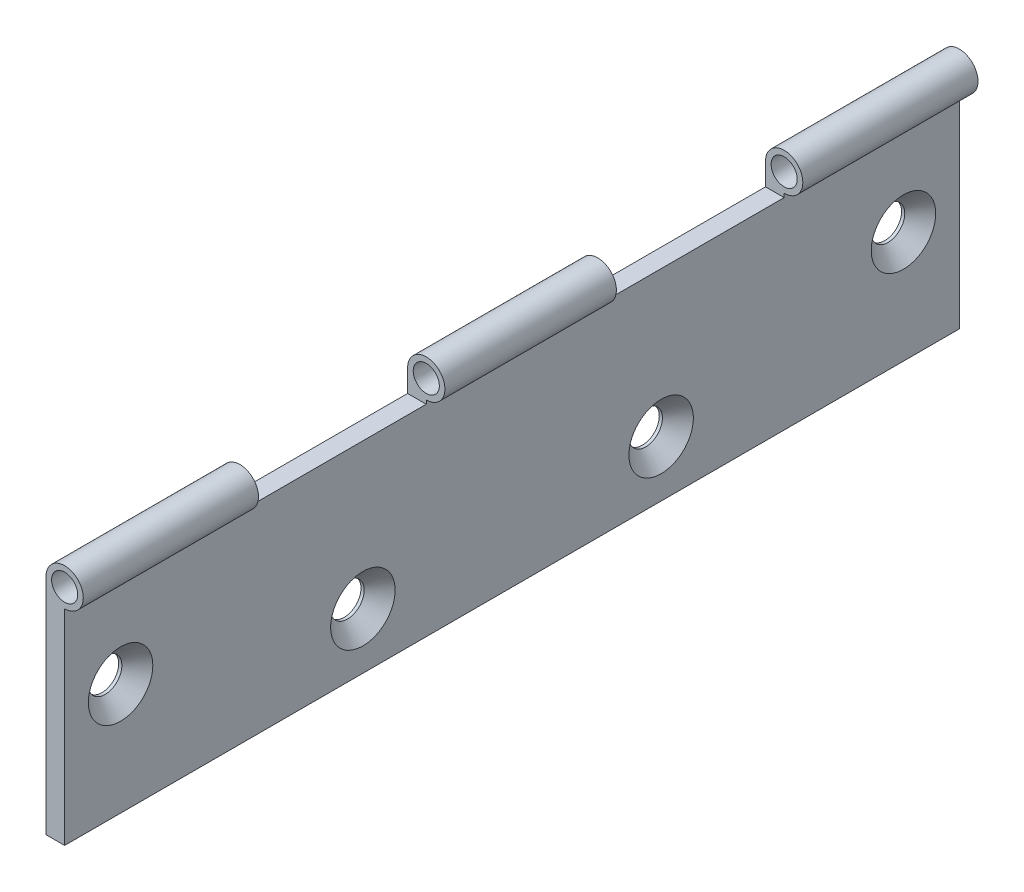
ISO-10303-21;
HEADER;
FILE_DESCRIPTION(('STEP AP214'),'2;1');
FILE_NAME('part.step','',(''),(''),'','','');
FILE_SCHEMA(('AUTOMOTIVE_DESIGN { 1 0 10303 214 1 1 1 1 }'));
ENDSEC;
DATA;
#1=APPLICATION_CONTEXT('core data for automotive mechanical design processes');
#2=APPLICATION_PROTOCOL_DEFINITION('international standard','automotive_design',2000,#1);
#3=PRODUCT_CONTEXT('',#1,'mechanical');
#4=PRODUCT('Part','Part','',(#3));
#5=PRODUCT_RELATED_PRODUCT_CATEGORY('part','',(#4));
#6=PRODUCT_DEFINITION_FORMATION('','',#4);
#7=PRODUCT_DEFINITION_CONTEXT('part definition',#1,'design');
#8=PRODUCT_DEFINITION('design','',#6,#7);
#9=PRODUCT_DEFINITION_SHAPE('','',#8);
#10=(LENGTH_UNIT() NAMED_UNIT(*) SI_UNIT(.MILLI.,.METRE.));
#11=(NAMED_UNIT(*) PLANE_ANGLE_UNIT() SI_UNIT($,.RADIAN.));
#12=(NAMED_UNIT(*) SI_UNIT($,.STERADIAN.) SOLID_ANGLE_UNIT());
#13=UNCERTAINTY_MEASURE_WITH_UNIT(LENGTH_MEASURE(1.E-05),#10,'distance_accuracy_value','');
#14=(GEOMETRIC_REPRESENTATION_CONTEXT(3) GLOBAL_UNCERTAINTY_ASSIGNED_CONTEXT((#13)) GLOBAL_UNIT_ASSIGNED_CONTEXT((#10,
#11,#12)) REPRESENTATION_CONTEXT('',''));
#15=CARTESIAN_POINT('',(0.,0.,0.));
#16=DIRECTION('',(0.,0.,1.));
#17=DIRECTION('',(1.,0.,0.));
#18=AXIS2_PLACEMENT_3D('',#15,#16,#17);
#19=CARTESIAN_POINT('',(5.,60.,-120.));
#20=DIRECTION('',(0.,0.,1.));
#21=DIRECTION('',(1.,0.,0.));
#22=AXIS2_PLACEMENT_3D('',#19,#20,#21);
#23=CYLINDRICAL_SURFACE('',#22,5.);
#24=CARTESIAN_POINT('',(5.,60.,-23.));
#25=DIRECTION('',(0.,0.,1.));
#26=DIRECTION('',(0.,-1.,0.));
#27=AXIS2_PLACEMENT_3D('',#24,#25,#26);
#28=CIRCLE('',#27,5.);
#29=CARTESIAN_POINT('',(0.,60.,-23.));
#30=VERTEX_POINT('',#29);
#31=CARTESIAN_POINT('',(5.,55.,-23.));
#32=VERTEX_POINT('',#31);
#33=EDGE_CURVE('E264',#30,#32,#28,.F.);
#34=ORIENTED_EDGE('',*,*,#33,.F.);
#35=DIRECTION('',(0.,0.,-1.));
#36=VECTOR('',#35,1.);
#37=CARTESIAN_POINT('',(0.,60.,120.));
#38=LINE('',#37,#36);
#39=CARTESIAN_POINT('',(0.,60.,23.));
#40=VERTEX_POINT('',#39);
#41=EDGE_CURVE('E105',#40,#30,#38,.T.);
#42=ORIENTED_EDGE('',*,*,#41,.F.);
#43=CARTESIAN_POINT('',(5.,60.,23.));
#44=DIRECTION('',(0.,0.,-1.));
#45=DIRECTION('',(-1.,0.,0.));
#46=AXIS2_PLACEMENT_3D('',#43,#44,#45);
#47=CIRCLE('',#46,5.);
#48=CARTESIAN_POINT('',(5.,55.,23.));
#49=VERTEX_POINT('',#48);
#50=EDGE_CURVE('E112',#49,#40,#47,.F.);
#51=ORIENTED_EDGE('',*,*,#50,.F.);
#52=DIRECTION('',(0.,0.,1.));
#53=VECTOR('',#52,1.);
#54=CARTESIAN_POINT('',(5.,55.,-120.));
#55=LINE('',#54,#53);
#56=EDGE_CURVE('E180',#32,#49,#55,.T.);
#57=ORIENTED_EDGE('',*,*,#56,.F.);
#58=EDGE_LOOP('',(#34,#42,#51,#57));
#59=FACE_BOUND('',#58,.T.);
#60=ADVANCED_FACE('F33',(#59),#23,.T.);
#61=CARTESIAN_POINT('',(5.,60.,-120.));
#62=DIRECTION('',(0.,0.,1.));
#63=DIRECTION('',(1.,0.,0.));
#64=AXIS2_PLACEMENT_3D('',#61,#62,#63);
#65=CYLINDRICAL_SURFACE('',#64,3.5);
#66=CARTESIAN_POINT('',(5.,60.,-73.));
#67=DIRECTION('',(0.,0.,-1.));
#68=DIRECTION('',(0.,1.,0.));
#69=AXIS2_PLACEMENT_3D('',#66,#67,#68);
#70=CIRCLE('',#69,3.5);
#71=CARTESIAN_POINT('',(5.,63.5,-73.));
#72=VERTEX_POINT('',#71);
#73=EDGE_CURVE('E273',#72,#72,#70,.F.);
#74=ORIENTED_EDGE('',*,*,#73,.T.);
#75=EDGE_LOOP('',(#74));
#76=FACE_BOUND('',#75,.T.);
#77=CARTESIAN_POINT('',(5.,60.,-120.));
#78=DIRECTION('',(0.,0.,1.));
#79=DIRECTION('',(1.,0.,0.));
#80=AXIS2_PLACEMENT_3D('',#77,#78,#79);
#81=CIRCLE('',#80,3.5);
#82=CARTESIAN_POINT('',(8.5,60.,-120.));
#83=VERTEX_POINT('',#82);
#84=EDGE_CURVE('E170',#83,#83,#81,.T.);
#85=ORIENTED_EDGE('',*,*,#84,.F.);
#86=EDGE_LOOP('',(#85));
#87=FACE_BOUND('',#86,.T.);
#88=ADVANCED_FACE('F311',(#76,#87),#65,.F.);
#89=CARTESIAN_POINT('',(5.,60.,-73.));
#90=DIRECTION('',(0.,0.,-1.));
#91=DIRECTION('',(0.,1.,0.));
#92=AXIS2_PLACEMENT_3D('',#89,#90,#91);
#93=CIRCLE('',#92,5.);
#94=CARTESIAN_POINT('',(5.,55.,-73.));
#95=VERTEX_POINT('',#94);
#96=CARTESIAN_POINT('',(0.,60.,-73.));
#97=VERTEX_POINT('',#96);
#98=EDGE_CURVE('E254',#95,#97,#93,.F.);
#99=ORIENTED_EDGE('',*,*,#98,.F.);
#100=CARTESIAN_POINT('',(5.,55.,-120.));
#101=VERTEX_POINT('',#100);
#102=EDGE_CURVE('E92',#101,#95,#55,.T.);
#103=ORIENTED_EDGE('',*,*,#102,.F.);
#104=CARTESIAN_POINT('',(5.,60.,-120.));
#105=DIRECTION('',(0.,0.,1.));
#106=DIRECTION('',(1.,0.,0.));
#107=AXIS2_PLACEMENT_3D('',#104,#105,#106);
#108=CIRCLE('',#107,5.);
#109=CARTESIAN_POINT('',(0.,60.,-120.));
#110=VERTEX_POINT('',#109);
#111=EDGE_CURVE('E90',#101,#110,#108,.T.);
#112=ORIENTED_EDGE('',*,*,#111,.T.);
#113=EDGE_CURVE('E102',#97,#110,#38,.T.);
#114=ORIENTED_EDGE('',*,*,#113,.F.);
#115=EDGE_LOOP('',(#99,#103,#112,#114));
#116=FACE_BOUND('',#115,.T.);
#117=ADVANCED_FACE('F303',(#116),#23,.T.);
#118=CARTESIAN_POINT('',(5.,60.,-23.));
#119=DIRECTION('',(0.,0.,1.));
#120=DIRECTION('',(0.,-1.,0.));
#121=AXIS2_PLACEMENT_3D('',#118,#119,#120);
#122=CIRCLE('',#121,3.5);
#123=CARTESIAN_POINT('',(5.,56.5,-23.));
#124=VERTEX_POINT('',#123);
#125=EDGE_CURVE('E266',#124,#124,#122,.F.);
#126=ORIENTED_EDGE('',*,*,#125,.T.);
#127=EDGE_LOOP('',(#126));
#128=FACE_BOUND('',#127,.T.);
#129=CARTESIAN_POINT('',(5.,60.,23.));
#130=DIRECTION('',(0.,0.,-1.));
#131=DIRECTION('',(-1.,0.,0.));
#132=AXIS2_PLACEMENT_3D('',#129,#130,#131);
#133=CIRCLE('',#132,3.5);
#134=CARTESIAN_POINT('',(1.5,60.,23.));
#135=VERTEX_POINT('',#134);
#136=EDGE_CURVE('E110',#135,#135,#133,.F.);
#137=ORIENTED_EDGE('',*,*,#136,.T.);
#138=EDGE_LOOP('',(#137));
#139=FACE_BOUND('',#138,.T.);
#140=ADVANCED_FACE('F312',(#128,#139),#65,.F.);
#141=CARTESIAN_POINT('',(5.,0.,120.));
#142=DIRECTION('',(-1.,0.,0.));
#143=DIRECTION('',(0.,0.,1.));
#144=AXIS2_PLACEMENT_3D('',#141,#142,#143);
#145=PLANE('',#144);
#146=CARTESIAN_POINT('',(5.,30.,-105.));
#147=DIRECTION('',(1.,0.,0.));
#148=DIRECTION('',(0.,0.,-1.));
#149=AXIS2_PLACEMENT_3D('',#146,#147,#148);
#150=CIRCLE('',#149,8.65);
#151=CARTESIAN_POINT('',(5.,30.,-113.65));
#152=VERTEX_POINT('',#151);
#153=EDGE_CURVE('E133',#152,#152,#150,.T.);
#154=ORIENTED_EDGE('',*,*,#153,.F.);
#155=EDGE_LOOP('',(#154));
#156=FACE_BOUND('',#155,.T.);
#157=CARTESIAN_POINT('',(5.,15.,-40.));
#158=DIRECTION('',(1.,0.,0.));
#159=DIRECTION('',(0.,0.,-1.));
#160=AXIS2_PLACEMENT_3D('',#157,#158,#159);
#161=CIRCLE('',#160,8.65);
#162=CARTESIAN_POINT('',(5.,15.,-48.65));
#163=VERTEX_POINT('',#162);
#164=EDGE_CURVE('E142',#163,#163,#161,.T.);
#165=ORIENTED_EDGE('',*,*,#164,.F.);
#166=EDGE_LOOP('',(#165));
#167=FACE_BOUND('',#166,.T.);
#168=CARTESIAN_POINT('',(5.,30.,105.));
#169=DIRECTION('',(1.,0.,0.));
#170=DIRECTION('',(0.,0.,-1.));
#171=AXIS2_PLACEMENT_3D('',#168,#169,#170);
#172=CIRCLE('',#171,8.65);
#173=CARTESIAN_POINT('',(5.,30.,96.35));
#174=VERTEX_POINT('',#173);
#175=EDGE_CURVE('E151',#174,#174,#172,.T.);
#176=ORIENTED_EDGE('',*,*,#175,.F.);
#177=EDGE_LOOP('',(#176));
#178=FACE_BOUND('',#177,.T.);
#179=CARTESIAN_POINT('',(5.,15.,40.));
#180=DIRECTION('',(1.,0.,0.));
#181=DIRECTION('',(0.,0.,-1.));
#182=AXIS2_PLACEMENT_3D('',#179,#180,#181);
#183=CIRCLE('',#182,8.65);
#184=CARTESIAN_POINT('',(5.,15.,31.35));
#185=VERTEX_POINT('',#184);
#186=EDGE_CURVE('E160',#185,#185,#183,.T.);
#187=ORIENTED_EDGE('',*,*,#186,.F.);
#188=EDGE_LOOP('',(#187));
#189=FACE_BOUND('',#188,.T.);
#190=ORIENTED_EDGE('',*,*,#102,.T.);
#191=DIRECTION('',(0.,-1.,0.));
#192=VECTOR('',#191,1.);
#193=CARTESIAN_POINT('',(5.,2.43492095173471E-13,-73.0000000000001));
#194=LINE('',#193,#192);
#195=CARTESIAN_POINT('',(5.,54.,-73.));
#196=VERTEX_POINT('',#195);
#197=EDGE_CURVE('E270',#95,#196,#194,.T.);
#198=ORIENTED_EDGE('',*,*,#197,.T.);
#199=DIRECTION('',(0.,0.,1.));
#200=VECTOR('',#199,1.);
#201=CARTESIAN_POINT('',(5.,54.,120.));
#202=LINE('',#201,#200);
#203=CARTESIAN_POINT('',(5.,54.,-23.));
#204=VERTEX_POINT('',#203);
#205=EDGE_CURVE('E244',#196,#204,#202,.T.);
#206=ORIENTED_EDGE('',*,*,#205,.T.);
#207=DIRECTION('',(0.,1.,0.));
#208=VECTOR('',#207,1.);
#209=CARTESIAN_POINT('',(5.,0.,-23.));
#210=LINE('',#209,#208);
#211=EDGE_CURVE('E248',#204,#32,#210,.T.);
#212=ORIENTED_EDGE('',*,*,#211,.T.);
#213=ORIENTED_EDGE('',*,*,#56,.T.);
#214=DIRECTION('',(0.,-1.,0.));
#215=VECTOR('',#214,1.);
#216=CARTESIAN_POINT('',(5.,0.,23.));
#217=LINE('',#216,#215);
#218=CARTESIAN_POINT('',(5.,54.,23.));
#219=VERTEX_POINT('',#218);
#220=EDGE_CURVE('E117',#49,#219,#217,.T.);
#221=ORIENTED_EDGE('',*,*,#220,.T.);
#222=DIRECTION('',(0.,0.,1.));
#223=VECTOR('',#222,1.);
#224=CARTESIAN_POINT('',(5.,54.,120.));
#225=LINE('',#224,#223);
#226=CARTESIAN_POINT('',(5.,54.,73.));
#227=VERTEX_POINT('',#226);
#228=EDGE_CURVE('E131',#219,#227,#225,.T.);
#229=ORIENTED_EDGE('',*,*,#228,.T.);
#230=DIRECTION('',(0.,1.,0.));
#231=VECTOR('',#230,1.);
#232=CARTESIAN_POINT('',(5.,0.,73.0000000000001));
#233=LINE('',#232,#231);
#234=CARTESIAN_POINT('',(5.,55.,73.));
#235=VERTEX_POINT('',#234);
#236=EDGE_CURVE('E113',#227,#235,#233,.T.);
#237=ORIENTED_EDGE('',*,*,#236,.T.);
#238=CARTESIAN_POINT('',(5.,55.,120.));
#239=VERTEX_POINT('',#238);
#240=EDGE_CURVE('E177',#235,#239,#55,.T.);
#241=ORIENTED_EDGE('',*,*,#240,.T.);
#242=DIRECTION('',(0.,1.,0.));
#243=VECTOR('',#242,1.);
#244=CARTESIAN_POINT('',(5.,0.,120.));
#245=LINE('',#244,#243);
#246=CARTESIAN_POINT('',(5.,0.,120.));
#247=VERTEX_POINT('',#246);
#248=EDGE_CURVE('E78',#247,#239,#245,.T.);
#249=ORIENTED_EDGE('',*,*,#248,.F.);
#250=DIRECTION('',(0.,0.,-1.));
#251=VECTOR('',#250,1.);
#252=CARTESIAN_POINT('',(5.,0.,120.));
#253=LINE('',#252,#251);
#254=CARTESIAN_POINT('',(5.,0.,-120.));
#255=VERTEX_POINT('',#254);
#256=EDGE_CURVE('E57',#247,#255,#253,.T.);
#257=ORIENTED_EDGE('',*,*,#256,.T.);
#258=DIRECTION('',(0.,1.,0.));
#259=VECTOR('',#258,1.);
#260=CARTESIAN_POINT('',(5.,0.,-120.));
#261=LINE('',#260,#259);
#262=EDGE_CURVE('E75',#255,#101,#261,.T.);
#263=ORIENTED_EDGE('',*,*,#262,.T.);
#264=EDGE_LOOP('',(#190,#198,#206,#212,#213,#221,#229,#237,#241,#249,#257,#263));
#265=FACE_BOUND('',#264,.T.);
#266=ADVANCED_FACE('F35',(#156,#167,#178,#189,#265),#145,.F.);
#267=CARTESIAN_POINT('',(0.,0.,120.));
#268=DIRECTION('',(-1.,0.,0.));
#269=DIRECTION('',(0.,0.,1.));
#270=AXIS2_PLACEMENT_3D('',#267,#268,#269);
#271=PLANE('',#270);
#272=DIRECTION('',(0.,1.,0.));
#273=VECTOR('',#272,1.);
#274=CARTESIAN_POINT('',(0.,65.,-73.));
#275=LINE('',#274,#273);
#276=CARTESIAN_POINT('',(0.,54.,-73.));
#277=VERTEX_POINT('',#276);
#278=EDGE_CURVE('E251',#277,#97,#275,.T.);
#279=ORIENTED_EDGE('',*,*,#278,.T.);
#280=ORIENTED_EDGE('',*,*,#113,.T.);
#281=DIRECTION('',(0.,1.,0.));
#282=VECTOR('',#281,1.);
#283=CARTESIAN_POINT('',(0.,0.,-120.));
#284=LINE('',#283,#282);
#285=CARTESIAN_POINT('',(0.,0.,-120.));
#286=VERTEX_POINT('',#285);
#287=EDGE_CURVE('E91',#286,#110,#284,.T.);
#288=ORIENTED_EDGE('',*,*,#287,.F.);
#289=DIRECTION('',(0.,0.,-1.));
#290=VECTOR('',#289,1.);
#291=CARTESIAN_POINT('',(0.,0.,120.));
#292=LINE('',#291,#290);
#293=CARTESIAN_POINT('',(0.,0.,120.));
#294=VERTEX_POINT('',#293);
#295=EDGE_CURVE('E80',#294,#286,#292,.T.);
#296=ORIENTED_EDGE('',*,*,#295,.F.);
#297=DIRECTION('',(0.,1.,0.));
#298=VECTOR('',#297,1.);
#299=CARTESIAN_POINT('',(0.,0.,120.));
#300=LINE('',#299,#298);
#301=CARTESIAN_POINT('',(0.,60.,120.));
#302=VERTEX_POINT('',#301);
#303=EDGE_CURVE('E97',#294,#302,#300,.T.);
#304=ORIENTED_EDGE('',*,*,#303,.T.);
#305=CARTESIAN_POINT('',(0.,60.,73.));
#306=VERTEX_POINT('',#305);
#307=EDGE_CURVE('E41',#302,#306,#38,.T.);
#308=ORIENTED_EDGE('',*,*,#307,.T.);
#309=DIRECTION('',(0.,-1.,0.));
#310=VECTOR('',#309,1.);
#311=CARTESIAN_POINT('',(0.,65.,73.));
#312=LINE('',#311,#310);
#313=CARTESIAN_POINT('',(0.,54.,73.));
#314=VERTEX_POINT('',#313);
#315=EDGE_CURVE('E276',#306,#314,#312,.T.);
#316=ORIENTED_EDGE('',*,*,#315,.T.);
#317=DIRECTION('',(0.,0.,-1.));
#318=VECTOR('',#317,1.);
#319=CARTESIAN_POINT('',(0.,54.,23.));
#320=LINE('',#319,#318);
#321=CARTESIAN_POINT('',(0.,54.,23.));
#322=VERTEX_POINT('',#321);
#323=EDGE_CURVE('E278',#314,#322,#320,.T.);
#324=ORIENTED_EDGE('',*,*,#323,.T.);
#325=DIRECTION('',(0.,1.,0.));
#326=VECTOR('',#325,1.);
#327=CARTESIAN_POINT('',(0.,65.,23.));
#328=LINE('',#327,#326);
#329=EDGE_CURVE('E281',#322,#40,#328,.T.);
#330=ORIENTED_EDGE('',*,*,#329,.T.);
#331=ORIENTED_EDGE('',*,*,#41,.T.);
#332=DIRECTION('',(0.,1.,0.));
#333=VECTOR('',#332,1.);
#334=CARTESIAN_POINT('',(0.,0.,-23.));
#335=LINE('',#334,#333);
#336=CARTESIAN_POINT('',(0.,54.,-23.));
#337=VERTEX_POINT('',#336);
#338=EDGE_CURVE('E11',#337,#30,#335,.T.);
#339=ORIENTED_EDGE('',*,*,#338,.F.);
#340=DIRECTION('',(0.,0.,-1.));
#341=VECTOR('',#340,1.);
#342=CARTESIAN_POINT('',(0.,54.,-73.));
#343=LINE('',#342,#341);
#344=EDGE_CURVE('E48',#337,#277,#343,.T.);
#345=ORIENTED_EDGE('',*,*,#344,.T.);
#346=EDGE_LOOP('',(#279,#280,#288,#296,#304,#308,#316,#324,#330,#331,#339,#345));
#347=FACE_BOUND('',#346,.T.);
#348=CARTESIAN_POINT('',(0.,30.,-105.));
#349=DIRECTION('',(1.,0.,0.));
#350=DIRECTION('',(0.,0.,-1.));
#351=AXIS2_PLACEMENT_3D('',#348,#349,#350);
#352=CIRCLE('',#351,4.5);
#353=CARTESIAN_POINT('',(0.,30.,-109.5));
#354=VERTEX_POINT('',#353);
#355=EDGE_CURVE('E139',#354,#354,#352,.T.);
#356=ORIENTED_EDGE('',*,*,#355,.T.);
#357=EDGE_LOOP('',(#356));
#358=FACE_BOUND('',#357,.T.);
#359=CARTESIAN_POINT('',(0.,15.,-40.));
#360=DIRECTION('',(1.,0.,0.));
#361=DIRECTION('',(0.,0.,-1.));
#362=AXIS2_PLACEMENT_3D('',#359,#360,#361);
#363=CIRCLE('',#362,4.5);
#364=CARTESIAN_POINT('',(0.,15.,-44.5));
#365=VERTEX_POINT('',#364);
#366=EDGE_CURVE('E148',#365,#365,#363,.T.);
#367=ORIENTED_EDGE('',*,*,#366,.T.);
#368=EDGE_LOOP('',(#367));
#369=FACE_BOUND('',#368,.T.);
#370=CARTESIAN_POINT('',(0.,30.,105.));
#371=DIRECTION('',(1.,0.,0.));
#372=DIRECTION('',(0.,0.,-1.));
#373=AXIS2_PLACEMENT_3D('',#370,#371,#372);
#374=CIRCLE('',#373,4.5);
#375=CARTESIAN_POINT('',(0.,30.,100.5));
#376=VERTEX_POINT('',#375);
#377=EDGE_CURVE('E157',#376,#376,#374,.T.);
#378=ORIENTED_EDGE('',*,*,#377,.T.);
#379=EDGE_LOOP('',(#378));
#380=FACE_BOUND('',#379,.T.);
#381=CARTESIAN_POINT('',(0.,15.,40.));
#382=DIRECTION('',(1.,0.,0.));
#383=DIRECTION('',(0.,0.,-1.));
#384=AXIS2_PLACEMENT_3D('',#381,#382,#383);
#385=CIRCLE('',#384,4.5);
#386=CARTESIAN_POINT('',(0.,15.,35.5));
#387=VERTEX_POINT('',#386);
#388=EDGE_CURVE('E166',#387,#387,#385,.T.);
#389=ORIENTED_EDGE('',*,*,#388,.T.);
#390=EDGE_LOOP('',(#389));
#391=FACE_BOUND('',#390,.T.);
#392=ADVANCED_FACE('F191',(#347,#358,#369,#380,#391),#271,.T.);
#393=CARTESIAN_POINT('',(5.,0.,120.));
#394=DIRECTION('',(0.,-1.,0.));
#395=DIRECTION('',(0.,0.,-1.));
#396=AXIS2_PLACEMENT_3D('',#393,#394,#395);
#397=PLANE('',#396);
#398=DIRECTION('',(-1.,0.,0.));
#399=VECTOR('',#398,1.);
#400=CARTESIAN_POINT('',(5.,0.,-120.));
#401=LINE('',#400,#399);
#402=EDGE_CURVE('E88',#255,#286,#401,.T.);
#403=ORIENTED_EDGE('',*,*,#402,.F.);
#404=ORIENTED_EDGE('',*,*,#256,.F.);
#405=DIRECTION('',(-1.,0.,0.));
#406=VECTOR('',#405,1.);
#407=CARTESIAN_POINT('',(5.,0.,120.));
#408=LINE('',#407,#406);
#409=EDGE_CURVE('E81',#247,#294,#408,.T.);
#410=ORIENTED_EDGE('',*,*,#409,.T.);
#411=ORIENTED_EDGE('',*,*,#295,.T.);
#412=EDGE_LOOP('',(#403,#404,#410,#411));
#413=FACE_BOUND('',#412,.T.);
#414=ADVANCED_FACE('F94',(#413),#397,.T.);
#415=CARTESIAN_POINT('',(0.,0.,120.));
#416=DIRECTION('',(0.,0.,-1.));
#417=DIRECTION('',(-1.,0.,0.));
#418=AXIS2_PLACEMENT_3D('',#415,#416,#417);
#419=PLANE('',#418);
#420=CARTESIAN_POINT('',(5.,60.,120.));
#421=DIRECTION('',(0.,0.,1.));
#422=DIRECTION('',(1.,0.,0.));
#423=AXIS2_PLACEMENT_3D('',#420,#421,#422);
#424=CIRCLE('',#423,3.5);
#425=CARTESIAN_POINT('',(8.5,60.,120.));
#426=VERTEX_POINT('',#425);
#427=EDGE_CURVE('E169',#426,#426,#424,.T.);
#428=ORIENTED_EDGE('',*,*,#427,.F.);
#429=EDGE_LOOP('',(#428));
#430=FACE_BOUND('',#429,.T.);
#431=ORIENTED_EDGE('',*,*,#248,.T.);
#432=CARTESIAN_POINT('',(5.,60.,120.));
#433=DIRECTION('',(0.,0.,1.));
#434=DIRECTION('',(1.,0.,0.));
#435=AXIS2_PLACEMENT_3D('',#432,#433,#434);
#436=CIRCLE('',#435,5.);
#437=EDGE_CURVE('E173',#239,#302,#436,.T.);
#438=ORIENTED_EDGE('',*,*,#437,.T.);
#439=ORIENTED_EDGE('',*,*,#303,.F.);
#440=ORIENTED_EDGE('',*,*,#409,.F.);
#441=EDGE_LOOP('',(#431,#438,#439,#440));
#442=FACE_BOUND('',#441,.T.);
#443=ADVANCED_FACE('F186',(#430,#442),#419,.F.);
#444=CARTESIAN_POINT('',(0.,0.,-120.));
#445=DIRECTION('',(0.,0.,-1.));
#446=DIRECTION('',(-1.,0.,0.));
#447=AXIS2_PLACEMENT_3D('',#444,#445,#446);
#448=PLANE('',#447);
#449=ORIENTED_EDGE('',*,*,#84,.T.);
#450=EDGE_LOOP('',(#449));
#451=FACE_BOUND('',#450,.T.);
#452=ORIENTED_EDGE('',*,*,#287,.T.);
#453=ORIENTED_EDGE('',*,*,#111,.F.);
#454=ORIENTED_EDGE('',*,*,#262,.F.);
#455=ORIENTED_EDGE('',*,*,#402,.T.);
#456=EDGE_LOOP('',(#452,#453,#454,#455));
#457=FACE_BOUND('',#456,.T.);
#458=ADVANCED_FACE('F87',(#451,#457),#448,.T.);
#459=CARTESIAN_POINT('',(5.,60.,73.));
#460=DIRECTION('',(0.,0.,1.));
#461=DIRECTION('',(0.,-1.,0.));
#462=AXIS2_PLACEMENT_3D('',#459,#460,#461);
#463=CIRCLE('',#462,5.);
#464=EDGE_CURVE('E108',#306,#235,#463,.F.);
#465=ORIENTED_EDGE('',*,*,#464,.F.);
#466=ORIENTED_EDGE('',*,*,#307,.F.);
#467=ORIENTED_EDGE('',*,*,#437,.F.);
#468=ORIENTED_EDGE('',*,*,#240,.F.);
#469=EDGE_LOOP('',(#465,#466,#467,#468));
#470=FACE_BOUND('',#469,.T.);
#471=ADVANCED_FACE('F299',(#470),#23,.T.);
#472=CARTESIAN_POINT('',(5.,60.,73.));
#473=DIRECTION('',(0.,0.,1.));
#474=DIRECTION('',(0.,-1.,0.));
#475=AXIS2_PLACEMENT_3D('',#472,#473,#474);
#476=CIRCLE('',#475,3.5);
#477=CARTESIAN_POINT('',(5.,56.5,73.));
#478=VERTEX_POINT('',#477);
#479=EDGE_CURVE('E106',#478,#478,#476,.F.);
#480=ORIENTED_EDGE('',*,*,#479,.T.);
#481=EDGE_LOOP('',(#480));
#482=FACE_BOUND('',#481,.T.);
#483=ORIENTED_EDGE('',*,*,#427,.T.);
#484=EDGE_LOOP('',(#483));
#485=FACE_BOUND('',#484,.T.);
#486=ADVANCED_FACE('F301',(#482,#485),#65,.F.);
#487=CARTESIAN_POINT('',(5.,15.,40.));
#488=DIRECTION('',(1.,0.,0.));
#489=DIRECTION('',(0.,0.,-1.));
#490=AXIS2_PLACEMENT_3D('',#487,#488,#489);
#491=CYLINDRICAL_SURFACE('',#490,4.5);
#492=ORIENTED_EDGE('',*,*,#388,.F.);
#493=EDGE_LOOP('',(#492));
#494=FACE_BOUND('',#493,.T.);
#495=CARTESIAN_POINT('',(0.850000000000003,15.,40.));
#496=DIRECTION('',(1.,0.,0.));
#497=DIRECTION('',(0.,0.,-1.));
#498=AXIS2_PLACEMENT_3D('',#495,#496,#497);
#499=CIRCLE('',#498,4.5);
#500=CARTESIAN_POINT('',(0.850000000000003,15.,35.5));
#501=VERTEX_POINT('',#500);
#502=EDGE_CURVE('E163',#501,#501,#499,.T.);
#503=ORIENTED_EDGE('',*,*,#502,.T.);
#504=EDGE_LOOP('',(#503));
#505=FACE_BOUND('',#504,.T.);
#506=ADVANCED_FACE('F308',(#494,#505),#491,.F.);
#507=CARTESIAN_POINT('',(5.,15.,40.));
#508=DIRECTION('',(1.,0.,0.));
#509=DIRECTION('',(0.,0.,-1.));
#510=AXIS2_PLACEMENT_3D('',#507,#508,#509);
#511=CONICAL_SURFACE('',#510,8.65,0.785398163397448);
#512=ORIENTED_EDGE('',*,*,#502,.F.);
#513=EDGE_LOOP('',(#512));
#514=FACE_BOUND('',#513,.T.);
#515=ORIENTED_EDGE('',*,*,#186,.T.);
#516=EDGE_LOOP('',(#515));
#517=FACE_BOUND('',#516,.T.);
#518=ADVANCED_FACE('F371',(#514,#517),#511,.F.);
#519=CARTESIAN_POINT('',(5.,30.,105.));
#520=DIRECTION('',(1.,0.,0.));
#521=DIRECTION('',(0.,0.,-1.));
#522=AXIS2_PLACEMENT_3D('',#519,#520,#521);
#523=CYLINDRICAL_SURFACE('',#522,4.5);
#524=ORIENTED_EDGE('',*,*,#377,.F.);
#525=EDGE_LOOP('',(#524));
#526=FACE_BOUND('',#525,.T.);
#527=CARTESIAN_POINT('',(0.850000000000003,30.,105.));
#528=DIRECTION('',(1.,0.,0.));
#529=DIRECTION('',(0.,0.,-1.));
#530=AXIS2_PLACEMENT_3D('',#527,#528,#529);
#531=CIRCLE('',#530,4.5);
#532=CARTESIAN_POINT('',(0.850000000000003,30.,100.5));
#533=VERTEX_POINT('',#532);
#534=EDGE_CURVE('E154',#533,#533,#531,.T.);
#535=ORIENTED_EDGE('',*,*,#534,.T.);
#536=EDGE_LOOP('',(#535));
#537=FACE_BOUND('',#536,.T.);
#538=ADVANCED_FACE('F367',(#526,#537),#523,.F.);
#539=CARTESIAN_POINT('',(5.,30.,105.));
#540=DIRECTION('',(1.,0.,0.));
#541=DIRECTION('',(0.,0.,-1.));
#542=AXIS2_PLACEMENT_3D('',#539,#540,#541);
#543=CONICAL_SURFACE('',#542,8.65,0.785398163397449);
#544=ORIENTED_EDGE('',*,*,#534,.F.);
#545=EDGE_LOOP('',(#544));
#546=FACE_BOUND('',#545,.T.);
#547=ORIENTED_EDGE('',*,*,#175,.T.);
#548=EDGE_LOOP('',(#547));
#549=FACE_BOUND('',#548,.T.);
#550=ADVANCED_FACE('F363',(#546,#549),#543,.F.);
#551=CARTESIAN_POINT('',(5.,15.,-40.));
#552=DIRECTION('',(1.,0.,0.));
#553=DIRECTION('',(0.,0.,-1.));
#554=AXIS2_PLACEMENT_3D('',#551,#552,#553);
#555=CYLINDRICAL_SURFACE('',#554,4.5);
#556=ORIENTED_EDGE('',*,*,#366,.F.);
#557=EDGE_LOOP('',(#556));
#558=FACE_BOUND('',#557,.T.);
#559=CARTESIAN_POINT('',(0.850000000000003,15.,-40.));
#560=DIRECTION('',(1.,0.,0.));
#561=DIRECTION('',(0.,0.,-1.));
#562=AXIS2_PLACEMENT_3D('',#559,#560,#561);
#563=CIRCLE('',#562,4.5);
#564=CARTESIAN_POINT('',(0.850000000000003,15.,-44.5));
#565=VERTEX_POINT('',#564);
#566=EDGE_CURVE('E145',#565,#565,#563,.T.);
#567=ORIENTED_EDGE('',*,*,#566,.T.);
#568=EDGE_LOOP('',(#567));
#569=FACE_BOUND('',#568,.T.);
#570=ADVANCED_FACE('F359',(#558,#569),#555,.F.);
#571=CARTESIAN_POINT('',(5.,15.,-40.));
#572=DIRECTION('',(1.,0.,0.));
#573=DIRECTION('',(0.,0.,-1.));
#574=AXIS2_PLACEMENT_3D('',#571,#572,#573);
#575=CONICAL_SURFACE('',#574,8.65,0.785398163397448);
#576=ORIENTED_EDGE('',*,*,#566,.F.);
#577=EDGE_LOOP('',(#576));
#578=FACE_BOUND('',#577,.T.);
#579=ORIENTED_EDGE('',*,*,#164,.T.);
#580=EDGE_LOOP('',(#579));
#581=FACE_BOUND('',#580,.T.);
#582=ADVANCED_FACE('F355',(#578,#581),#575,.F.);
#583=CARTESIAN_POINT('',(5.,30.,-105.));
#584=DIRECTION('',(1.,0.,0.));
#585=DIRECTION('',(0.,0.,-1.));
#586=AXIS2_PLACEMENT_3D('',#583,#584,#585);
#587=CYLINDRICAL_SURFACE('',#586,4.5);
#588=ORIENTED_EDGE('',*,*,#355,.F.);
#589=EDGE_LOOP('',(#588));
#590=FACE_BOUND('',#589,.T.);
#591=CARTESIAN_POINT('',(0.850000000000003,30.,-105.));
#592=DIRECTION('',(1.,0.,0.));
#593=DIRECTION('',(0.,0.,-1.));
#594=AXIS2_PLACEMENT_3D('',#591,#592,#593);
#595=CIRCLE('',#594,4.5);
#596=CARTESIAN_POINT('',(0.850000000000003,30.,-109.5));
#597=VERTEX_POINT('',#596);
#598=EDGE_CURVE('E136',#597,#597,#595,.T.);
#599=ORIENTED_EDGE('',*,*,#598,.T.);
#600=EDGE_LOOP('',(#599));
#601=FACE_BOUND('',#600,.T.);
#602=ADVANCED_FACE('F351',(#590,#601),#587,.F.);
#603=CARTESIAN_POINT('',(5.,30.,-105.));
#604=DIRECTION('',(1.,0.,0.));
#605=DIRECTION('',(0.,0.,-1.));
#606=AXIS2_PLACEMENT_3D('',#603,#604,#605);
#607=CONICAL_SURFACE('',#606,8.65,0.785398163397449);
#608=ORIENTED_EDGE('',*,*,#598,.F.);
#609=EDGE_LOOP('',(#608));
#610=FACE_BOUND('',#609,.T.);
#611=ORIENTED_EDGE('',*,*,#153,.T.);
#612=EDGE_LOOP('',(#611));
#613=FACE_BOUND('',#612,.T.);
#614=ADVANCED_FACE('F345',(#610,#613),#607,.F.);
#615=CARTESIAN_POINT('',(0.,54.,23.));
#616=DIRECTION('',(0.,-1.,0.));
#617=DIRECTION('',(0.,0.,-1.));
#618=AXIS2_PLACEMENT_3D('',#615,#616,#617);
#619=PLANE('',#618);
#620=DIRECTION('',(1.,0.,0.));
#621=VECTOR('',#620,1.);
#622=CARTESIAN_POINT('',(0.,54.,23.));
#623=LINE('',#622,#621);
#624=EDGE_CURVE('E109',#322,#219,#623,.T.);
#625=ORIENTED_EDGE('',*,*,#624,.F.);
#626=ORIENTED_EDGE('',*,*,#323,.F.);
#627=DIRECTION('',(1.,0.,0.));
#628=VECTOR('',#627,1.);
#629=CARTESIAN_POINT('',(0.,54.,73.));
#630=LINE('',#629,#628);
#631=EDGE_CURVE('E284',#314,#227,#630,.T.);
#632=ORIENTED_EDGE('',*,*,#631,.T.);
#633=ORIENTED_EDGE('',*,*,#228,.F.);
#634=EDGE_LOOP('',(#625,#626,#632,#633));
#635=FACE_BOUND('',#634,.T.);
#636=ADVANCED_FACE('F289',(#635),#619,.F.);
#637=CARTESIAN_POINT('',(0.,65.,23.));
#638=DIRECTION('',(0.,0.,-1.));
#639=DIRECTION('',(-1.,0.,0.));
#640=AXIS2_PLACEMENT_3D('',#637,#638,#639);
#641=PLANE('',#640);
#642=ORIENTED_EDGE('',*,*,#136,.F.);
#643=EDGE_LOOP('',(#642));
#644=FACE_BOUND('',#643,.T.);
#645=ORIENTED_EDGE('',*,*,#220,.F.);
#646=ORIENTED_EDGE('',*,*,#50,.T.);
#647=ORIENTED_EDGE('',*,*,#329,.F.);
#648=ORIENTED_EDGE('',*,*,#624,.T.);
#649=EDGE_LOOP('',(#645,#646,#647,#648));
#650=FACE_BOUND('',#649,.T.);
#651=ADVANCED_FACE('F295',(#644,#650),#641,.F.);
#652=CARTESIAN_POINT('',(0.,65.,73.));
#653=DIRECTION('',(0.,0.,1.));
#654=DIRECTION('',(0.,-1.,0.));
#655=AXIS2_PLACEMENT_3D('',#652,#653,#654);
#656=PLANE('',#655);
#657=ORIENTED_EDGE('',*,*,#479,.F.);
#658=EDGE_LOOP('',(#657));
#659=FACE_BOUND('',#658,.T.);
#660=ORIENTED_EDGE('',*,*,#631,.F.);
#661=ORIENTED_EDGE('',*,*,#315,.F.);
#662=ORIENTED_EDGE('',*,*,#464,.T.);
#663=ORIENTED_EDGE('',*,*,#236,.F.);
#664=EDGE_LOOP('',(#660,#661,#662,#663));
#665=FACE_BOUND('',#664,.T.);
#666=ADVANCED_FACE('F298',(#659,#665),#656,.F.);
#667=CARTESIAN_POINT('',(0.,65.,-73.));
#668=DIRECTION('',(0.,0.,-1.));
#669=DIRECTION('',(0.,1.,0.));
#670=AXIS2_PLACEMENT_3D('',#667,#668,#669);
#671=PLANE('',#670);
#672=ORIENTED_EDGE('',*,*,#98,.T.);
#673=ORIENTED_EDGE('',*,*,#278,.F.);
#674=DIRECTION('',(1.,0.,0.));
#675=VECTOR('',#674,1.);
#676=CARTESIAN_POINT('',(0.,54.,-73.));
#677=LINE('',#676,#675);
#678=EDGE_CURVE('E240',#277,#196,#677,.T.);
#679=ORIENTED_EDGE('',*,*,#678,.T.);
#680=ORIENTED_EDGE('',*,*,#197,.F.);
#681=EDGE_LOOP('',(#672,#673,#679,#680));
#682=FACE_BOUND('',#681,.T.);
#683=ORIENTED_EDGE('',*,*,#73,.F.);
#684=EDGE_LOOP('',(#683));
#685=FACE_BOUND('',#684,.T.);
#686=ADVANCED_FACE('F252',(#682,#685),#671,.F.);
#687=CARTESIAN_POINT('',(0.,54.,-73.));
#688=DIRECTION('',(0.,-1.,0.));
#689=DIRECTION('',(0.,0.,-1.));
#690=AXIS2_PLACEMENT_3D('',#687,#688,#689);
#691=PLANE('',#690);
#692=ORIENTED_EDGE('',*,*,#678,.F.);
#693=ORIENTED_EDGE('',*,*,#344,.F.);
#694=DIRECTION('',(1.,0.,0.));
#695=VECTOR('',#694,1.);
#696=CARTESIAN_POINT('',(0.,54.,-23.));
#697=LINE('',#696,#695);
#698=EDGE_CURVE('E249',#337,#204,#697,.T.);
#699=ORIENTED_EDGE('',*,*,#698,.T.);
#700=ORIENTED_EDGE('',*,*,#205,.F.);
#701=EDGE_LOOP('',(#692,#693,#699,#700));
#702=FACE_BOUND('',#701,.T.);
#703=ADVANCED_FACE('F242',(#702),#691,.F.);
#704=CARTESIAN_POINT('',(0.,65.,-23.));
#705=DIRECTION('',(0.,0.,1.));
#706=DIRECTION('',(0.,-1.,0.));
#707=AXIS2_PLACEMENT_3D('',#704,#705,#706);
#708=PLANE('',#707);
#709=ORIENTED_EDGE('',*,*,#33,.T.);
#710=ORIENTED_EDGE('',*,*,#211,.F.);
#711=ORIENTED_EDGE('',*,*,#698,.F.);
#712=ORIENTED_EDGE('',*,*,#338,.T.);
#713=EDGE_LOOP('',(#709,#710,#711,#712));
#714=FACE_BOUND('',#713,.T.);
#715=ORIENTED_EDGE('',*,*,#125,.F.);
#716=EDGE_LOOP('',(#715));
#717=FACE_BOUND('',#716,.T.);
#718=ADVANCED_FACE('F328',(#714,#717),#708,.F.);
#719=CLOSED_SHELL('',(#60,#88,#117,#140,#266,#392,#414,#443,#458,#471,#486,#506,#518,#538,#550,
#570,#582,#602,#614,#636,#651,#666,#686,#703,#718));
#720=MANIFOLD_SOLID_BREP('B2',#719);
#721=ADVANCED_BREP_SHAPE_REPRESENTATION('',(#18,#720),#14);
#722=SHAPE_DEFINITION_REPRESENTATION(#9,#721);
ENDSEC;
END-ISO-10303-21;
